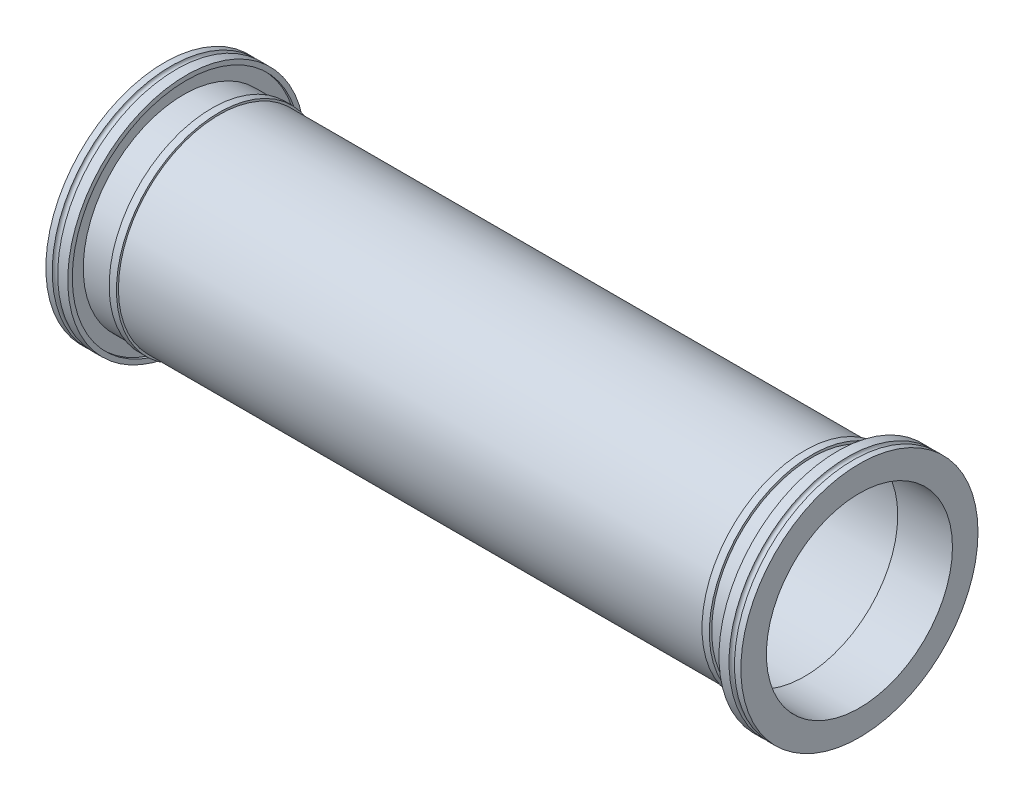
ISO-10303-21;
HEADER;
FILE_DESCRIPTION(('STEP AP214'),'2;1');
FILE_NAME('part.step','',(''),(''),'','','');
FILE_SCHEMA(('AUTOMOTIVE_DESIGN { 1 0 10303 214 1 1 1 1 }'));
ENDSEC;
DATA;
#1=APPLICATION_CONTEXT('core data for automotive mechanical design processes');
#2=APPLICATION_PROTOCOL_DEFINITION('international standard','automotive_design',2000,#1);
#3=PRODUCT_CONTEXT('',#1,'mechanical');
#4=PRODUCT('Part','Part','',(#3));
#5=PRODUCT_RELATED_PRODUCT_CATEGORY('part','',(#4));
#6=PRODUCT_DEFINITION_FORMATION('','',#4);
#7=PRODUCT_DEFINITION_CONTEXT('part definition',#1,'design');
#8=PRODUCT_DEFINITION('design','',#6,#7);
#9=PRODUCT_DEFINITION_SHAPE('','',#8);
#10=(LENGTH_UNIT() NAMED_UNIT(*) SI_UNIT(.MILLI.,.METRE.));
#11=(NAMED_UNIT(*) PLANE_ANGLE_UNIT() SI_UNIT($,.RADIAN.));
#12=(NAMED_UNIT(*) SI_UNIT($,.STERADIAN.) SOLID_ANGLE_UNIT());
#13=UNCERTAINTY_MEASURE_WITH_UNIT(LENGTH_MEASURE(1.E-05),#10,'distance_accuracy_value','');
#14=(GEOMETRIC_REPRESENTATION_CONTEXT(3) GLOBAL_UNCERTAINTY_ASSIGNED_CONTEXT((#13)) GLOBAL_UNIT_ASSIGNED_CONTEXT((#10,
#11,#12)) REPRESENTATION_CONTEXT('',''));
#15=CARTESIAN_POINT('',(0.,0.,0.));
#16=DIRECTION('',(0.,0.,1.));
#17=DIRECTION('',(1.,0.,0.));
#18=AXIS2_PLACEMENT_3D('',#15,#16,#17);
#19=CARTESIAN_POINT('',(30.,-56.3,0.));
#20=DIRECTION('',(-1.,0.,0.));
#21=DIRECTION('',(0.,0.,1.));
#22=AXIS2_PLACEMENT_3D('',#19,#20,#21);
#23=PLANE('',#22);
#24=CARTESIAN_POINT('',(30.,0.,0.));
#25=DIRECTION('',(1.,0.,0.));
#26=DIRECTION('',(0.,0.,-1.));
#27=AXIS2_PLACEMENT_3D('',#24,#25,#26);
#28=CIRCLE('',#27,51.);
#29=CARTESIAN_POINT('',(30.,0.,-51.));
#30=VERTEX_POINT('',#29);
#31=EDGE_CURVE('E50',#30,#30,#28,.T.);
#32=ORIENTED_EDGE('',*,*,#31,.F.);
#33=EDGE_LOOP('',(#32));
#34=FACE_BOUND('',#33,.T.);
#35=CARTESIAN_POINT('',(30.,0.,0.));
#36=DIRECTION('',(1.,0.,0.));
#37=DIRECTION('',(0.,0.,-1.));
#38=AXIS2_PLACEMENT_3D('',#35,#36,#37);
#39=CIRCLE('',#38,55.);
#40=CARTESIAN_POINT('',(30.,0.,-55.));
#41=VERTEX_POINT('',#40);
#42=EDGE_CURVE('E90',#41,#41,#39,.T.);
#43=ORIENTED_EDGE('',*,*,#42,.T.);
#44=EDGE_LOOP('',(#43));
#45=FACE_BOUND('',#44,.T.);
#46=ADVANCED_FACE('F43',(#34,#45),#23,.F.);
#47=CARTESIAN_POINT('',(400.5834,0.,0.));
#48=DIRECTION('',(1.,0.,0.));
#49=DIRECTION('',(0.,0.,-1.));
#50=AXIS2_PLACEMENT_3D('',#47,#48,#49);
#51=CYLINDRICAL_SURFACE('',#50,51.);
#52=CARTESIAN_POINT('',(0.,0.,0.));
#53=DIRECTION('',(1.,0.,0.));
#54=DIRECTION('',(0.,0.,-1.));
#55=AXIS2_PLACEMENT_3D('',#52,#53,#54);
#56=CIRCLE('',#55,51.);
#57=CARTESIAN_POINT('',(0.,0.,-51.));
#58=VERTEX_POINT('',#57);
#59=EDGE_CURVE('E87',#58,#58,#56,.T.);
#60=ORIENTED_EDGE('',*,*,#59,.F.);
#61=EDGE_LOOP('',(#60));
#62=FACE_BOUND('',#61,.T.);
#63=ORIENTED_EDGE('',*,*,#31,.T.);
#64=EDGE_LOOP('',(#63));
#65=FACE_BOUND('',#64,.T.);
#66=ADVANCED_FACE('F45',(#62,#65),#51,.F.);
#67=CARTESIAN_POINT('',(30.,0.,0.));
#68=DIRECTION('',(-1.,0.,0.));
#69=DIRECTION('',(0.,0.,1.));
#70=AXIS2_PLACEMENT_3D('',#67,#68,#69);
#71=CIRCLE('',#70,55.2);
#72=CARTESIAN_POINT('',(30.,0.,55.2));
#73=VERTEX_POINT('',#72);
#74=EDGE_CURVE('E11',#73,#73,#71,.F.);
#75=ORIENTED_EDGE('',*,*,#74,.F.);
#76=EDGE_LOOP('',(#75));
#77=FACE_BOUND('',#76,.T.);
#78=CARTESIAN_POINT('',(30.,0.,0.));
#79=DIRECTION('',(1.,0.,0.));
#80=DIRECTION('',(0.,0.,-1.));
#81=AXIS2_PLACEMENT_3D('',#78,#79,#80);
#82=CIRCLE('',#81,56.3);
#83=CARTESIAN_POINT('',(30.,0.,-56.3));
#84=VERTEX_POINT('',#83);
#85=EDGE_CURVE('E54',#84,#84,#82,.T.);
#86=ORIENTED_EDGE('',*,*,#85,.T.);
#87=EDGE_LOOP('',(#86));
#88=FACE_BOUND('',#87,.T.);
#89=ADVANCED_FACE('F159',(#77,#88),#23,.F.);
#90=CARTESIAN_POINT('',(400.5834,0.,0.));
#91=DIRECTION('',(1.,0.,0.));
#92=DIRECTION('',(0.,0.,-1.));
#93=AXIS2_PLACEMENT_3D('',#90,#91,#92);
#94=CYLINDRICAL_SURFACE('',#93,56.3);
#95=ORIENTED_EDGE('',*,*,#85,.F.);
#96=EDGE_LOOP('',(#95));
#97=FACE_BOUND('',#96,.T.);
#98=CARTESIAN_POINT('',(26.,0.,0.));
#99=DIRECTION('',(1.,0.,0.));
#100=DIRECTION('',(0.,0.,-1.));
#101=AXIS2_PLACEMENT_3D('',#98,#99,#100);
#102=CIRCLE('',#101,56.3);
#103=CARTESIAN_POINT('',(26.,0.,-56.3));
#104=VERTEX_POINT('',#103);
#105=EDGE_CURVE('E58',#104,#104,#102,.T.);
#106=ORIENTED_EDGE('',*,*,#105,.T.);
#107=EDGE_LOOP('',(#106));
#108=FACE_BOUND('',#107,.T.);
#109=ADVANCED_FACE('F168',(#97,#108),#94,.T.);
#110=CARTESIAN_POINT('',(26.,-55.,0.));
#111=DIRECTION('',(1.,0.,0.));
#112=DIRECTION('',(0.,0.,-1.));
#113=AXIS2_PLACEMENT_3D('',#110,#111,#112);
#114=PLANE('',#113);
#115=ORIENTED_EDGE('',*,*,#105,.F.);
#116=EDGE_LOOP('',(#115));
#117=FACE_BOUND('',#116,.T.);
#118=CARTESIAN_POINT('',(26.,0.,0.));
#119=DIRECTION('',(1.,0.,0.));
#120=DIRECTION('',(0.,0.,-1.));
#121=AXIS2_PLACEMENT_3D('',#118,#119,#120);
#122=CIRCLE('',#121,55.);
#123=CARTESIAN_POINT('',(26.,0.,-55.));
#124=VERTEX_POINT('',#123);
#125=EDGE_CURVE('E63',#124,#124,#122,.T.);
#126=ORIENTED_EDGE('',*,*,#125,.T.);
#127=EDGE_LOOP('',(#126));
#128=FACE_BOUND('',#127,.T.);
#129=ADVANCED_FACE('F174',(#117,#128),#114,.F.);
#130=CARTESIAN_POINT('',(400.5834,0.,0.));
#131=DIRECTION('',(1.,0.,0.));
#132=DIRECTION('',(0.,0.,-1.));
#133=AXIS2_PLACEMENT_3D('',#130,#131,#132);
#134=CYLINDRICAL_SURFACE('',#133,55.);
#135=ORIENTED_EDGE('',*,*,#125,.F.);
#136=EDGE_LOOP('',(#135));
#137=FACE_BOUND('',#136,.T.);
#138=CARTESIAN_POINT('',(10.5,0.,0.));
#139=DIRECTION('',(1.,0.,0.));
#140=DIRECTION('',(0.,0.,-1.));
#141=AXIS2_PLACEMENT_3D('',#138,#139,#140);
#142=CIRCLE('',#141,55.);
#143=CARTESIAN_POINT('',(10.5,0.,-55.));
#144=VERTEX_POINT('',#143);
#145=EDGE_CURVE('E66',#144,#144,#142,.T.);
#146=ORIENTED_EDGE('',*,*,#145,.T.);
#147=EDGE_LOOP('',(#146));
#148=FACE_BOUND('',#147,.T.);
#149=ADVANCED_FACE('F183',(#137,#148),#134,.T.);
#150=CARTESIAN_POINT('',(10.5,-62.5,0.));
#151=DIRECTION('',(-1.,0.,0.));
#152=DIRECTION('',(0.,0.,1.));
#153=AXIS2_PLACEMENT_3D('',#150,#151,#152);
#154=PLANE('',#153);
#155=ORIENTED_EDGE('',*,*,#145,.F.);
#156=EDGE_LOOP('',(#155));
#157=FACE_BOUND('',#156,.T.);
#158=CARTESIAN_POINT('',(10.5,0.,0.));
#159=DIRECTION('',(1.,0.,0.));
#160=DIRECTION('',(0.,0.,-1.));
#161=AXIS2_PLACEMENT_3D('',#158,#159,#160);
#162=CIRCLE('',#161,62.5);
#163=CARTESIAN_POINT('',(10.5,0.,-62.5));
#164=VERTEX_POINT('',#163);
#165=EDGE_CURVE('E69',#164,#164,#162,.T.);
#166=ORIENTED_EDGE('',*,*,#165,.T.);
#167=EDGE_LOOP('',(#166));
#168=FACE_BOUND('',#167,.T.);
#169=ADVANCED_FACE('F189',(#157,#168),#154,.F.);
#170=CARTESIAN_POINT('',(400.5834,0.,0.));
#171=DIRECTION('',(1.,0.,0.));
#172=DIRECTION('',(0.,0.,-1.));
#173=AXIS2_PLACEMENT_3D('',#170,#171,#172);
#174=CYLINDRICAL_SURFACE('',#173,62.5);
#175=ORIENTED_EDGE('',*,*,#165,.F.);
#176=EDGE_LOOP('',(#175));
#177=FACE_BOUND('',#176,.T.);
#178=CARTESIAN_POINT('',(12.,0.,0.));
#179=DIRECTION('',(1.,0.,0.));
#180=DIRECTION('',(0.,0.,-1.));
#181=AXIS2_PLACEMENT_3D('',#178,#179,#180);
#182=CIRCLE('',#181,62.5);
#183=CARTESIAN_POINT('',(12.,0.,-62.5));
#184=VERTEX_POINT('',#183);
#185=EDGE_CURVE('E72',#184,#184,#182,.T.);
#186=ORIENTED_EDGE('',*,*,#185,.T.);
#187=EDGE_LOOP('',(#186));
#188=FACE_BOUND('',#187,.T.);
#189=ADVANCED_FACE('F195',(#177,#188),#174,.F.);
#190=CARTESIAN_POINT('',(12.,-65.,0.));
#191=DIRECTION('',(-1.,0.,0.));
#192=DIRECTION('',(0.,0.,1.));
#193=AXIS2_PLACEMENT_3D('',#190,#191,#192);
#194=PLANE('',#193);
#195=ORIENTED_EDGE('',*,*,#185,.F.);
#196=EDGE_LOOP('',(#195));
#197=FACE_BOUND('',#196,.T.);
#198=CARTESIAN_POINT('',(12.,0.,0.));
#199=DIRECTION('',(1.,0.,0.));
#200=DIRECTION('',(0.,0.,-1.));
#201=AXIS2_PLACEMENT_3D('',#198,#199,#200);
#202=CIRCLE('',#201,65.);
#203=CARTESIAN_POINT('',(12.,0.,-65.));
#204=VERTEX_POINT('',#203);
#205=EDGE_CURVE('E75',#204,#204,#202,.T.);
#206=ORIENTED_EDGE('',*,*,#205,.T.);
#207=EDGE_LOOP('',(#206));
#208=FACE_BOUND('',#207,.T.);
#209=ADVANCED_FACE('F201',(#197,#208),#194,.F.);
#210=CARTESIAN_POINT('',(400.5834,0.,0.));
#211=DIRECTION('',(1.,0.,0.));
#212=DIRECTION('',(0.,0.,-1.));
#213=AXIS2_PLACEMENT_3D('',#210,#211,#212);
#214=CYLINDRICAL_SURFACE('',#213,65.);
#215=ORIENTED_EDGE('',*,*,#205,.F.);
#216=EDGE_LOOP('',(#215));
#217=FACE_BOUND('',#216,.T.);
#218=CARTESIAN_POINT('',(6.50000000000001,0.,0.));
#219=DIRECTION('',(1.,0.,0.));
#220=DIRECTION('',(0.,0.,-1.));
#221=AXIS2_PLACEMENT_3D('',#218,#219,#220);
#222=CIRCLE('',#221,65.);
#223=CARTESIAN_POINT('',(6.50000000000001,0.,-65.));
#224=VERTEX_POINT('',#223);
#225=EDGE_CURVE('E78',#224,#224,#222,.T.);
#226=ORIENTED_EDGE('',*,*,#225,.T.);
#227=EDGE_LOOP('',(#226));
#228=FACE_BOUND('',#227,.T.);
#229=ADVANCED_FACE('F207',(#217,#228),#214,.T.);
#230=CARTESIAN_POINT('',(5.,0.,0.));
#231=DIRECTION('',(1.,0.,0.));
#232=DIRECTION('',(0.,0.,-1.));
#233=AXIS2_PLACEMENT_3D('',#230,#231,#232);
#234=TOROIDAL_SURFACE('',#233,65.,1.5);
#235=ORIENTED_EDGE('',*,*,#225,.F.);
#236=EDGE_LOOP('',(#235));
#237=FACE_BOUND('',#236,.T.);
#238=CARTESIAN_POINT('',(3.5,0.,0.));
#239=DIRECTION('',(1.,0.,0.));
#240=DIRECTION('',(0.,0.,-1.));
#241=AXIS2_PLACEMENT_3D('',#238,#239,#240);
#242=CIRCLE('',#241,65.);
#243=CARTESIAN_POINT('',(3.5,0.,-65.));
#244=VERTEX_POINT('',#243);
#245=EDGE_CURVE('E81',#244,#244,#242,.T.);
#246=ORIENTED_EDGE('',*,*,#245,.T.);
#247=EDGE_LOOP('',(#246));
#248=FACE_BOUND('',#247,.T.);
#249=ADVANCED_FACE('F213',(#237,#248),#234,.F.);
#250=CARTESIAN_POINT('',(400.5834,0.,0.));
#251=DIRECTION('',(1.,0.,0.));
#252=DIRECTION('',(0.,0.,-1.));
#253=AXIS2_PLACEMENT_3D('',#250,#251,#252);
#254=CYLINDRICAL_SURFACE('',#253,65.);
#255=ORIENTED_EDGE('',*,*,#245,.F.);
#256=EDGE_LOOP('',(#255));
#257=FACE_BOUND('',#256,.T.);
#258=CARTESIAN_POINT('',(0.,0.,0.));
#259=DIRECTION('',(1.,0.,0.));
#260=DIRECTION('',(0.,0.,-1.));
#261=AXIS2_PLACEMENT_3D('',#258,#259,#260);
#262=CIRCLE('',#261,65.);
#263=CARTESIAN_POINT('',(0.,0.,-65.));
#264=VERTEX_POINT('',#263);
#265=EDGE_CURVE('E84',#264,#264,#262,.T.);
#266=ORIENTED_EDGE('',*,*,#265,.T.);
#267=EDGE_LOOP('',(#266));
#268=FACE_BOUND('',#267,.T.);
#269=ADVANCED_FACE('F219',(#257,#268),#254,.T.);
#270=CARTESIAN_POINT('',(0.,-51.,0.));
#271=DIRECTION('',(1.,0.,0.));
#272=DIRECTION('',(0.,0.,-1.));
#273=AXIS2_PLACEMENT_3D('',#270,#271,#272);
#274=PLANE('',#273);
#275=ORIENTED_EDGE('',*,*,#265,.F.);
#276=EDGE_LOOP('',(#275));
#277=FACE_BOUND('',#276,.T.);
#278=ORIENTED_EDGE('',*,*,#59,.T.);
#279=EDGE_LOOP('',(#278));
#280=FACE_BOUND('',#279,.T.);
#281=ADVANCED_FACE('F225',(#277,#280),#274,.F.);
#282=CARTESIAN_POINT('',(190.5026,0.,0.));
#283=DIRECTION('',(-1.,0.,0.));
#284=DIRECTION('',(0.,0.,1.));
#285=AXIS2_PLACEMENT_3D('',#282,#283,#284);
#286=CYLINDRICAL_SURFACE('',#285,55.2);
#287=ORIENTED_EDGE('',*,*,#74,.T.);
#288=EDGE_LOOP('',(#287));
#289=FACE_BOUND('',#288,.T.);
#290=CARTESIAN_POINT('',(351.0052,0.,0.));
#291=DIRECTION('',(-1.,0.,0.));
#292=DIRECTION('',(0.,0.,1.));
#293=AXIS2_PLACEMENT_3D('',#290,#291,#292);
#294=CIRCLE('',#293,55.2);
#295=CARTESIAN_POINT('',(351.0052,0.,55.2));
#296=VERTEX_POINT('',#295);
#297=EDGE_CURVE('E93',#296,#296,#294,.F.);
#298=ORIENTED_EDGE('',*,*,#297,.F.);
#299=EDGE_LOOP('',(#298));
#300=FACE_BOUND('',#299,.T.);
#301=ADVANCED_FACE('F150',(#289,#300),#286,.T.);
#302=CARTESIAN_POINT('',(190.5026,0.,0.));
#303=DIRECTION('',(-1.,0.,0.));
#304=DIRECTION('',(0.,0.,1.));
#305=AXIS2_PLACEMENT_3D('',#302,#303,#304);
#306=CYLINDRICAL_SURFACE('',#305,55.);
#307=ORIENTED_EDGE('',*,*,#42,.F.);
#308=EDGE_LOOP('',(#307));
#309=FACE_BOUND('',#308,.T.);
#310=CARTESIAN_POINT('',(351.0052,0.,0.));
#311=DIRECTION('',(1.,0.,0.));
#312=DIRECTION('',(0.,0.,-1.));
#313=AXIS2_PLACEMENT_3D('',#310,#311,#312);
#314=CIRCLE('',#313,55.);
#315=CARTESIAN_POINT('',(351.0052,0.,-55.));
#316=VERTEX_POINT('',#315);
#317=EDGE_CURVE('E132',#316,#316,#314,.T.);
#318=ORIENTED_EDGE('',*,*,#317,.T.);
#319=EDGE_LOOP('',(#318));
#320=FACE_BOUND('',#319,.T.);
#321=ADVANCED_FACE('F136',(#309,#320),#306,.F.);
#322=CARTESIAN_POINT('',(351.0052,-56.3,0.));
#323=DIRECTION('',(1.,0.,0.));
#324=DIRECTION('',(0.,0.,1.));
#325=AXIS2_PLACEMENT_3D('',#322,#323,#324);
#326=PLANE('',#325);
#327=CARTESIAN_POINT('',(351.0052,0.,0.));
#328=DIRECTION('',(1.,0.,0.));
#329=DIRECTION('',(0.,0.,-1.));
#330=AXIS2_PLACEMENT_3D('',#327,#328,#329);
#331=CIRCLE('',#330,51.);
#332=CARTESIAN_POINT('',(351.0052,0.,-51.));
#333=VERTEX_POINT('',#332);
#334=EDGE_CURVE('E96',#333,#333,#331,.T.);
#335=ORIENTED_EDGE('',*,*,#334,.T.);
#336=EDGE_LOOP('',(#335));
#337=FACE_BOUND('',#336,.T.);
#338=ORIENTED_EDGE('',*,*,#317,.F.);
#339=EDGE_LOOP('',(#338));
#340=FACE_BOUND('',#339,.T.);
#341=ADVANCED_FACE('F138',(#337,#340),#326,.F.);
#342=CARTESIAN_POINT('',(-19.5781999999999,0.,0.));
#343=DIRECTION('',(-1.,0.,0.));
#344=DIRECTION('',(0.,0.,-1.));
#345=AXIS2_PLACEMENT_3D('',#342,#343,#344);
#346=CYLINDRICAL_SURFACE('',#345,51.);
#347=CARTESIAN_POINT('',(381.0052,0.,0.));
#348=DIRECTION('',(1.,0.,0.));
#349=DIRECTION('',(0.,0.,-1.));
#350=AXIS2_PLACEMENT_3D('',#347,#348,#349);
#351=CIRCLE('',#350,51.);
#352=CARTESIAN_POINT('',(381.0052,0.,-51.));
#353=VERTEX_POINT('',#352);
#354=EDGE_CURVE('E129',#353,#353,#351,.T.);
#355=ORIENTED_EDGE('',*,*,#354,.T.);
#356=EDGE_LOOP('',(#355));
#357=FACE_BOUND('',#356,.T.);
#358=ORIENTED_EDGE('',*,*,#334,.F.);
#359=EDGE_LOOP('',(#358));
#360=FACE_BOUND('',#359,.T.);
#361=ADVANCED_FACE('F140',(#357,#360),#346,.F.);
#362=ORIENTED_EDGE('',*,*,#297,.T.);
#363=EDGE_LOOP('',(#362));
#364=FACE_BOUND('',#363,.T.);
#365=CARTESIAN_POINT('',(351.0052,0.,0.));
#366=DIRECTION('',(1.,0.,0.));
#367=DIRECTION('',(0.,0.,-1.));
#368=AXIS2_PLACEMENT_3D('',#365,#366,#367);
#369=CIRCLE('',#368,56.3);
#370=CARTESIAN_POINT('',(351.0052,0.,-56.3));
#371=VERTEX_POINT('',#370);
#372=EDGE_CURVE('E99',#371,#371,#369,.T.);
#373=ORIENTED_EDGE('',*,*,#372,.F.);
#374=EDGE_LOOP('',(#373));
#375=FACE_BOUND('',#374,.T.);
#376=ADVANCED_FACE('F143',(#364,#375),#326,.F.);
#377=CARTESIAN_POINT('',(-19.5781999999999,0.,0.));
#378=DIRECTION('',(-1.,0.,0.));
#379=DIRECTION('',(0.,0.,-1.));
#380=AXIS2_PLACEMENT_3D('',#377,#378,#379);
#381=CYLINDRICAL_SURFACE('',#380,56.3);
#382=ORIENTED_EDGE('',*,*,#372,.T.);
#383=EDGE_LOOP('',(#382));
#384=FACE_BOUND('',#383,.T.);
#385=CARTESIAN_POINT('',(355.0052,0.,0.));
#386=DIRECTION('',(1.,0.,0.));
#387=DIRECTION('',(0.,0.,-1.));
#388=AXIS2_PLACEMENT_3D('',#385,#386,#387);
#389=CIRCLE('',#388,56.3);
#390=CARTESIAN_POINT('',(355.0052,0.,-56.3));
#391=VERTEX_POINT('',#390);
#392=EDGE_CURVE('E102',#391,#391,#389,.T.);
#393=ORIENTED_EDGE('',*,*,#392,.F.);
#394=EDGE_LOOP('',(#393));
#395=FACE_BOUND('',#394,.T.);
#396=ADVANCED_FACE('F155',(#384,#395),#381,.T.);
#397=CARTESIAN_POINT('',(355.0052,-55.,0.));
#398=DIRECTION('',(-1.,0.,0.));
#399=DIRECTION('',(0.,0.,-1.));
#400=AXIS2_PLACEMENT_3D('',#397,#398,#399);
#401=PLANE('',#400);
#402=ORIENTED_EDGE('',*,*,#392,.T.);
#403=EDGE_LOOP('',(#402));
#404=FACE_BOUND('',#403,.T.);
#405=CARTESIAN_POINT('',(355.0052,0.,0.));
#406=DIRECTION('',(1.,0.,0.));
#407=DIRECTION('',(0.,0.,-1.));
#408=AXIS2_PLACEMENT_3D('',#405,#406,#407);
#409=CIRCLE('',#408,55.);
#410=CARTESIAN_POINT('',(355.0052,0.,-55.));
#411=VERTEX_POINT('',#410);
#412=EDGE_CURVE('E105',#411,#411,#409,.T.);
#413=ORIENTED_EDGE('',*,*,#412,.F.);
#414=EDGE_LOOP('',(#413));
#415=FACE_BOUND('',#414,.T.);
#416=ADVANCED_FACE('F244',(#404,#415),#401,.F.);
#417=CARTESIAN_POINT('',(-19.5781999999999,0.,0.));
#418=DIRECTION('',(-1.,0.,0.));
#419=DIRECTION('',(0.,0.,-1.));
#420=AXIS2_PLACEMENT_3D('',#417,#418,#419);
#421=CYLINDRICAL_SURFACE('',#420,55.);
#422=ORIENTED_EDGE('',*,*,#412,.T.);
#423=EDGE_LOOP('',(#422));
#424=FACE_BOUND('',#423,.T.);
#425=CARTESIAN_POINT('',(370.5052,0.,0.));
#426=DIRECTION('',(1.,0.,0.));
#427=DIRECTION('',(0.,0.,-1.));
#428=AXIS2_PLACEMENT_3D('',#425,#426,#427);
#429=CIRCLE('',#428,55.);
#430=CARTESIAN_POINT('',(370.5052,0.,-55.));
#431=VERTEX_POINT('',#430);
#432=EDGE_CURVE('E108',#431,#431,#429,.T.);
#433=ORIENTED_EDGE('',*,*,#432,.F.);
#434=EDGE_LOOP('',(#433));
#435=FACE_BOUND('',#434,.T.);
#436=ADVANCED_FACE('F249',(#424,#435),#421,.T.);
#437=CARTESIAN_POINT('',(370.5052,-62.5,0.));
#438=DIRECTION('',(1.,0.,0.));
#439=DIRECTION('',(0.,0.,1.));
#440=AXIS2_PLACEMENT_3D('',#437,#438,#439);
#441=PLANE('',#440);
#442=ORIENTED_EDGE('',*,*,#432,.T.);
#443=EDGE_LOOP('',(#442));
#444=FACE_BOUND('',#443,.T.);
#445=CARTESIAN_POINT('',(370.5052,0.,0.));
#446=DIRECTION('',(1.,0.,0.));
#447=DIRECTION('',(0.,0.,-1.));
#448=AXIS2_PLACEMENT_3D('',#445,#446,#447);
#449=CIRCLE('',#448,62.5);
#450=CARTESIAN_POINT('',(370.5052,0.,-62.5));
#451=VERTEX_POINT('',#450);
#452=EDGE_CURVE('E111',#451,#451,#449,.T.);
#453=ORIENTED_EDGE('',*,*,#452,.F.);
#454=EDGE_LOOP('',(#453));
#455=FACE_BOUND('',#454,.T.);
#456=ADVANCED_FACE('F255',(#444,#455),#441,.F.);
#457=CARTESIAN_POINT('',(-19.5781999999999,0.,0.));
#458=DIRECTION('',(-1.,0.,0.));
#459=DIRECTION('',(0.,0.,-1.));
#460=AXIS2_PLACEMENT_3D('',#457,#458,#459);
#461=CYLINDRICAL_SURFACE('',#460,62.5);
#462=ORIENTED_EDGE('',*,*,#452,.T.);
#463=EDGE_LOOP('',(#462));
#464=FACE_BOUND('',#463,.T.);
#465=CARTESIAN_POINT('',(369.0052,0.,0.));
#466=DIRECTION('',(1.,0.,0.));
#467=DIRECTION('',(0.,0.,-1.));
#468=AXIS2_PLACEMENT_3D('',#465,#466,#467);
#469=CIRCLE('',#468,62.5);
#470=CARTESIAN_POINT('',(369.0052,0.,-62.5));
#471=VERTEX_POINT('',#470);
#472=EDGE_CURVE('E114',#471,#471,#469,.T.);
#473=ORIENTED_EDGE('',*,*,#472,.F.);
#474=EDGE_LOOP('',(#473));
#475=FACE_BOUND('',#474,.T.);
#476=ADVANCED_FACE('F261',(#464,#475),#461,.F.);
#477=CARTESIAN_POINT('',(369.0052,-65.,0.));
#478=DIRECTION('',(1.,0.,0.));
#479=DIRECTION('',(0.,0.,1.));
#480=AXIS2_PLACEMENT_3D('',#477,#478,#479);
#481=PLANE('',#480);
#482=ORIENTED_EDGE('',*,*,#472,.T.);
#483=EDGE_LOOP('',(#482));
#484=FACE_BOUND('',#483,.T.);
#485=CARTESIAN_POINT('',(369.0052,0.,0.));
#486=DIRECTION('',(1.,0.,0.));
#487=DIRECTION('',(0.,0.,-1.));
#488=AXIS2_PLACEMENT_3D('',#485,#486,#487);
#489=CIRCLE('',#488,65.);
#490=CARTESIAN_POINT('',(369.0052,0.,-65.));
#491=VERTEX_POINT('',#490);
#492=EDGE_CURVE('E117',#491,#491,#489,.T.);
#493=ORIENTED_EDGE('',*,*,#492,.F.);
#494=EDGE_LOOP('',(#493));
#495=FACE_BOUND('',#494,.T.);
#496=ADVANCED_FACE('F267',(#484,#495),#481,.F.);
#497=CARTESIAN_POINT('',(-19.5781999999999,0.,0.));
#498=DIRECTION('',(-1.,0.,0.));
#499=DIRECTION('',(0.,0.,-1.));
#500=AXIS2_PLACEMENT_3D('',#497,#498,#499);
#501=CYLINDRICAL_SURFACE('',#500,65.);
#502=ORIENTED_EDGE('',*,*,#492,.T.);
#503=EDGE_LOOP('',(#502));
#504=FACE_BOUND('',#503,.T.);
#505=CARTESIAN_POINT('',(374.5052,0.,0.));
#506=DIRECTION('',(1.,0.,0.));
#507=DIRECTION('',(0.,0.,-1.));
#508=AXIS2_PLACEMENT_3D('',#505,#506,#507);
#509=CIRCLE('',#508,65.);
#510=CARTESIAN_POINT('',(374.5052,0.,-65.));
#511=VERTEX_POINT('',#510);
#512=EDGE_CURVE('E120',#511,#511,#509,.T.);
#513=ORIENTED_EDGE('',*,*,#512,.F.);
#514=EDGE_LOOP('',(#513));
#515=FACE_BOUND('',#514,.T.);
#516=ADVANCED_FACE('F273',(#504,#515),#501,.T.);
#517=CARTESIAN_POINT('',(376.0052,0.,0.));
#518=DIRECTION('',(-1.,0.,0.));
#519=DIRECTION('',(0.,0.,-1.));
#520=AXIS2_PLACEMENT_3D('',#517,#518,#519);
#521=TOROIDAL_SURFACE('',#520,65.,1.5);
#522=ORIENTED_EDGE('',*,*,#512,.T.);
#523=EDGE_LOOP('',(#522));
#524=FACE_BOUND('',#523,.T.);
#525=CARTESIAN_POINT('',(377.5052,0.,0.));
#526=DIRECTION('',(1.,0.,0.));
#527=DIRECTION('',(0.,0.,-1.));
#528=AXIS2_PLACEMENT_3D('',#525,#526,#527);
#529=CIRCLE('',#528,65.);
#530=CARTESIAN_POINT('',(377.5052,0.,-65.));
#531=VERTEX_POINT('',#530);
#532=EDGE_CURVE('E123',#531,#531,#529,.T.);
#533=ORIENTED_EDGE('',*,*,#532,.F.);
#534=EDGE_LOOP('',(#533));
#535=FACE_BOUND('',#534,.T.);
#536=ADVANCED_FACE('F279',(#524,#535),#521,.F.);
#537=CARTESIAN_POINT('',(-19.5781999999999,0.,0.));
#538=DIRECTION('',(-1.,0.,0.));
#539=DIRECTION('',(0.,0.,-1.));
#540=AXIS2_PLACEMENT_3D('',#537,#538,#539);
#541=CYLINDRICAL_SURFACE('',#540,65.);
#542=ORIENTED_EDGE('',*,*,#532,.T.);
#543=EDGE_LOOP('',(#542));
#544=FACE_BOUND('',#543,.T.);
#545=CARTESIAN_POINT('',(381.0052,0.,0.));
#546=DIRECTION('',(1.,0.,0.));
#547=DIRECTION('',(0.,0.,-1.));
#548=AXIS2_PLACEMENT_3D('',#545,#546,#547);
#549=CIRCLE('',#548,65.);
#550=CARTESIAN_POINT('',(381.0052,0.,-65.));
#551=VERTEX_POINT('',#550);
#552=EDGE_CURVE('E126',#551,#551,#549,.T.);
#553=ORIENTED_EDGE('',*,*,#552,.F.);
#554=EDGE_LOOP('',(#553));
#555=FACE_BOUND('',#554,.T.);
#556=ADVANCED_FACE('F285',(#544,#555),#541,.T.);
#557=CARTESIAN_POINT('',(381.0052,-51.,0.));
#558=DIRECTION('',(-1.,0.,0.));
#559=DIRECTION('',(0.,0.,-1.));
#560=AXIS2_PLACEMENT_3D('',#557,#558,#559);
#561=PLANE('',#560);
#562=ORIENTED_EDGE('',*,*,#552,.T.);
#563=EDGE_LOOP('',(#562));
#564=FACE_BOUND('',#563,.T.);
#565=ORIENTED_EDGE('',*,*,#354,.F.);
#566=EDGE_LOOP('',(#565));
#567=FACE_BOUND('',#566,.T.);
#568=ADVANCED_FACE('F291',(#564,#567),#561,.F.);
#569=CLOSED_SHELL('',(#46,#66,#89,#109,#129,#149,#169,#189,#209,#229,#249,#269,#281,#301,#321,
#341,#361,#376,#396,#416,#436,#456,#476,#496,#516,#536,#556,#568));
#570=MANIFOLD_SOLID_BREP('B2',#569);
#571=ADVANCED_BREP_SHAPE_REPRESENTATION('',(#18,#570),#14);
#572=SHAPE_DEFINITION_REPRESENTATION(#9,#571);
ENDSEC;
END-ISO-10303-21;
